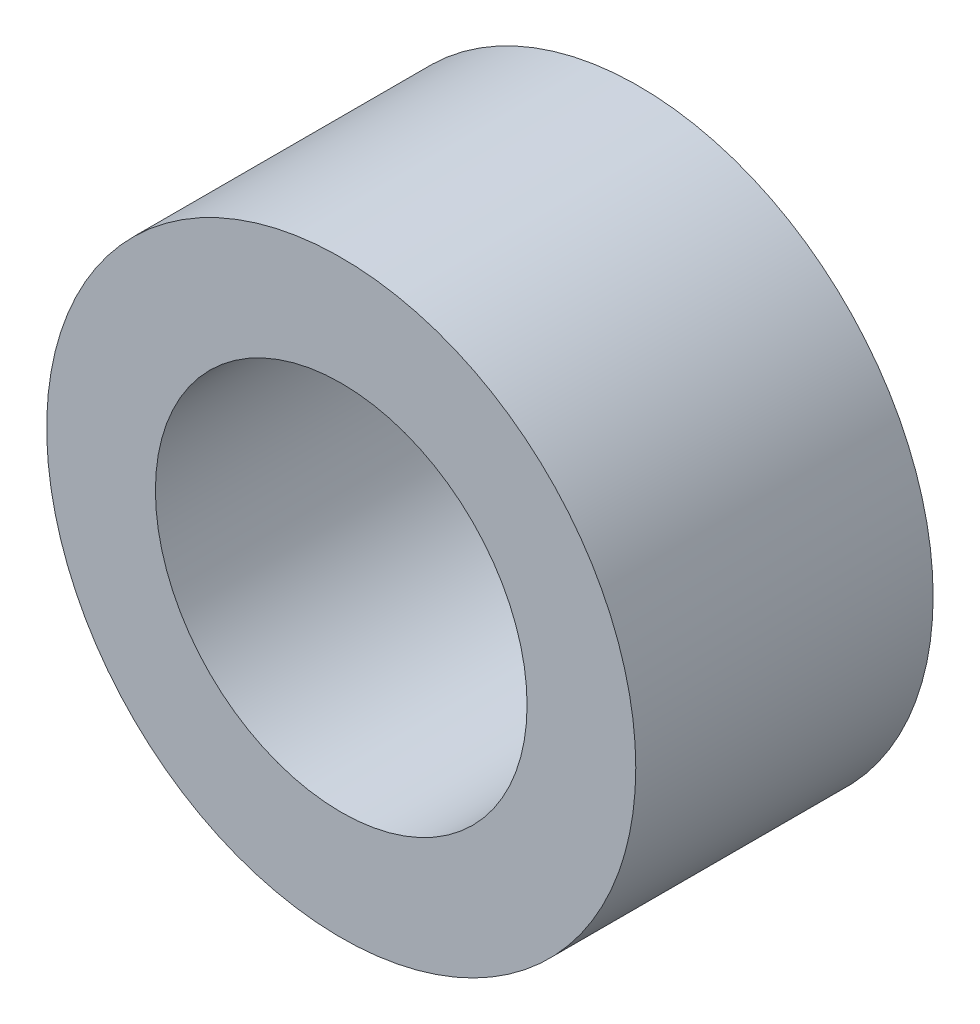
ISO-10303-21;
HEADER;
FILE_DESCRIPTION(('STEP AP214'),'2;1');
FILE_NAME('part.step','',(''),(''),'','','');
FILE_SCHEMA(('AUTOMOTIVE_DESIGN { 1 0 10303 214 1 1 1 1 }'));
ENDSEC;
DATA;
#1=APPLICATION_CONTEXT('core data for automotive mechanical design processes');
#2=APPLICATION_PROTOCOL_DEFINITION('international standard','automotive_design',2000,#1);
#3=PRODUCT_CONTEXT('',#1,'mechanical');
#4=PRODUCT('Part','Part','',(#3));
#5=PRODUCT_RELATED_PRODUCT_CATEGORY('part','',(#4));
#6=PRODUCT_DEFINITION_FORMATION('','',#4);
#7=PRODUCT_DEFINITION_CONTEXT('part definition',#1,'design');
#8=PRODUCT_DEFINITION('design','',#6,#7);
#9=PRODUCT_DEFINITION_SHAPE('','',#8);
#10=(LENGTH_UNIT() NAMED_UNIT(*) SI_UNIT(.MILLI.,.METRE.));
#11=(NAMED_UNIT(*) PLANE_ANGLE_UNIT() SI_UNIT($,.RADIAN.));
#12=(NAMED_UNIT(*) SI_UNIT($,.STERADIAN.) SOLID_ANGLE_UNIT());
#13=UNCERTAINTY_MEASURE_WITH_UNIT(LENGTH_MEASURE(1.E-05),#10,'distance_accuracy_value','');
#14=(GEOMETRIC_REPRESENTATION_CONTEXT(3) GLOBAL_UNCERTAINTY_ASSIGNED_CONTEXT((#13)) GLOBAL_UNIT_ASSIGNED_CONTEXT((#10,
#11,#12)) REPRESENTATION_CONTEXT('',''));
#15=CARTESIAN_POINT('',(0.,0.,0.));
#16=DIRECTION('',(0.,0.,1.));
#17=DIRECTION('',(1.,0.,0.));
#18=AXIS2_PLACEMENT_3D('',#15,#16,#17);
#19=CARTESIAN_POINT('',(0.,0.,4.));
#20=DIRECTION('',(0.,0.,1.));
#21=DIRECTION('',(1.,0.,0.));
#22=AXIS2_PLACEMENT_3D('',#19,#20,#21);
#23=PLANE('',#22);
#24=CARTESIAN_POINT('',(0.,0.,4.));
#25=DIRECTION('',(0.,0.,1.));
#26=DIRECTION('',(1.,0.,0.));
#27=AXIS2_PLACEMENT_3D('',#24,#25,#26);
#28=CIRCLE('',#27,3.9624);
#29=CARTESIAN_POINT('',(3.9624,0.,4.));
#30=VERTEX_POINT('',#29);
#31=EDGE_CURVE('E10',#30,#30,#28,.T.);
#32=ORIENTED_EDGE('',*,*,#31,.T.);
#33=EDGE_LOOP('',(#32));
#34=FACE_BOUND('',#33,.T.);
#35=CARTESIAN_POINT('',(0.,0.,4.));
#36=DIRECTION('',(0.,0.,1.));
#37=DIRECTION('',(1.,0.,0.));
#38=AXIS2_PLACEMENT_3D('',#35,#36,#37);
#39=CIRCLE('',#38,2.5);
#40=CARTESIAN_POINT('',(2.5,0.,4.));
#41=VERTEX_POINT('',#40);
#42=EDGE_CURVE('E41',#41,#41,#39,.T.);
#43=ORIENTED_EDGE('',*,*,#42,.F.);
#44=EDGE_LOOP('',(#43));
#45=FACE_BOUND('',#44,.T.);
#46=ADVANCED_FACE('F30',(#34,#45),#23,.T.);
#47=CARTESIAN_POINT('',(0.,0.,0.));
#48=DIRECTION('',(0.,0.,1.));
#49=DIRECTION('',(1.,0.,0.));
#50=AXIS2_PLACEMENT_3D('',#47,#48,#49);
#51=PLANE('',#50);
#52=CARTESIAN_POINT('',(0.,0.,0.));
#53=DIRECTION('',(0.,0.,1.));
#54=DIRECTION('',(1.,0.,0.));
#55=AXIS2_PLACEMENT_3D('',#52,#53,#54);
#56=CIRCLE('',#55,3.9624);
#57=CARTESIAN_POINT('',(3.9624,0.,0.));
#58=VERTEX_POINT('',#57);
#59=EDGE_CURVE('E34',#58,#58,#56,.T.);
#60=ORIENTED_EDGE('',*,*,#59,.F.);
#61=EDGE_LOOP('',(#60));
#62=FACE_BOUND('',#61,.T.);
#63=CARTESIAN_POINT('',(0.,0.,0.));
#64=DIRECTION('',(0.,0.,1.));
#65=DIRECTION('',(1.,0.,0.));
#66=AXIS2_PLACEMENT_3D('',#63,#64,#65);
#67=CIRCLE('',#66,2.5);
#68=CARTESIAN_POINT('',(2.5,0.,0.));
#69=VERTEX_POINT('',#68);
#70=EDGE_CURVE('E43',#69,#69,#67,.T.);
#71=ORIENTED_EDGE('',*,*,#70,.T.);
#72=EDGE_LOOP('',(#71));
#73=FACE_BOUND('',#72,.T.);
#74=ADVANCED_FACE('F53',(#62,#73),#51,.F.);
#75=CARTESIAN_POINT('',(0.,0.,4.));
#76=DIRECTION('',(0.,0.,-1.));
#77=DIRECTION('',(-1.,0.,0.));
#78=AXIS2_PLACEMENT_3D('',#75,#76,#77);
#79=CYLINDRICAL_SURFACE('',#78,3.9624);
#80=ORIENTED_EDGE('',*,*,#31,.F.);
#81=EDGE_LOOP('',(#80));
#82=FACE_BOUND('',#81,.T.);
#83=ORIENTED_EDGE('',*,*,#59,.T.);
#84=EDGE_LOOP('',(#83));
#85=FACE_BOUND('',#84,.T.);
#86=ADVANCED_FACE('F32',(#82,#85),#79,.T.);
#87=CARTESIAN_POINT('',(0.,0.,4.));
#88=DIRECTION('',(0.,0.,-1.));
#89=DIRECTION('',(-1.,0.,0.));
#90=AXIS2_PLACEMENT_3D('',#87,#88,#89);
#91=CYLINDRICAL_SURFACE('',#90,2.5);
#92=ORIENTED_EDGE('',*,*,#42,.T.);
#93=EDGE_LOOP('',(#92));
#94=FACE_BOUND('',#93,.T.);
#95=ORIENTED_EDGE('',*,*,#70,.F.);
#96=EDGE_LOOP('',(#95));
#97=FACE_BOUND('',#96,.T.);
#98=ADVANCED_FACE('F49',(#94,#97),#91,.F.);
#99=CLOSED_SHELL('',(#46,#74,#86,#98));
#100=MANIFOLD_SOLID_BREP('B2',#99);
#101=ADVANCED_BREP_SHAPE_REPRESENTATION('',(#18,#100),#14);
#102=SHAPE_DEFINITION_REPRESENTATION(#9,#101);
ENDSEC;
END-ISO-10303-21;
